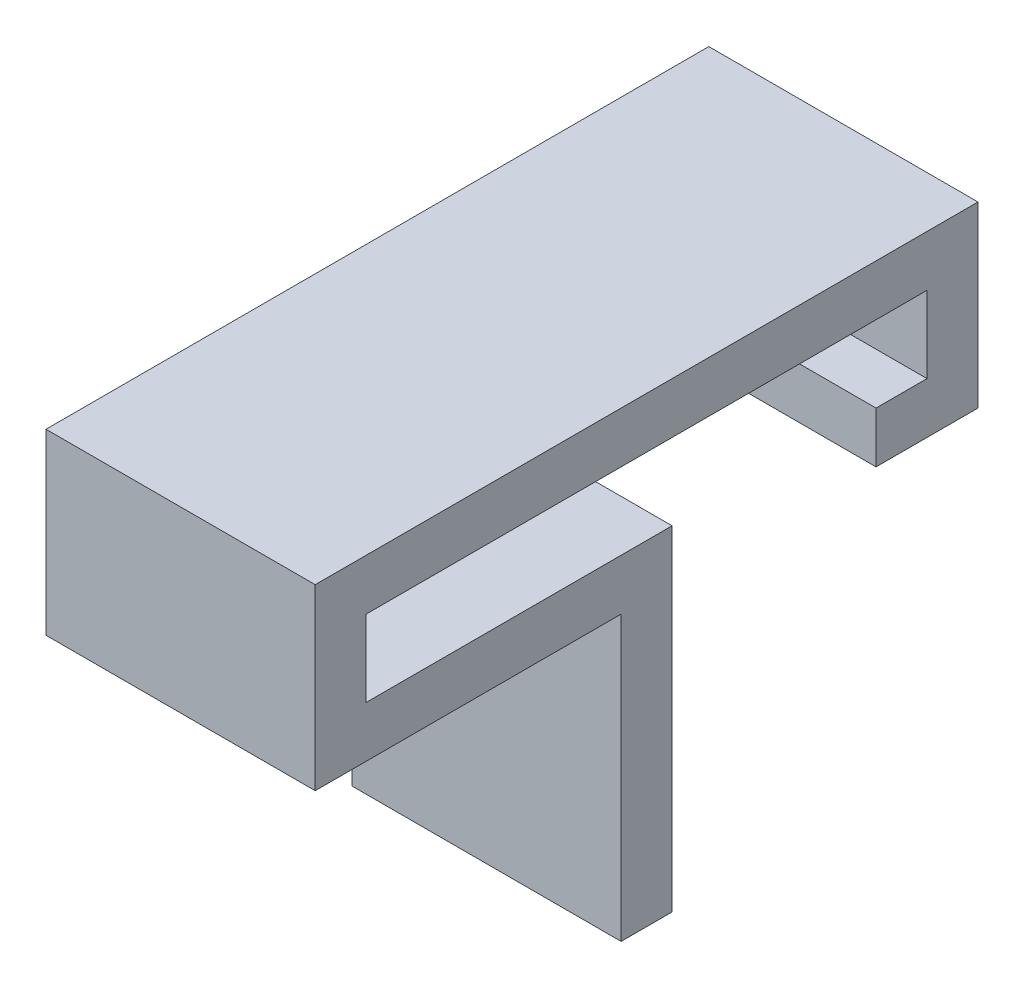
ISO-10303-21;
HEADER;
FILE_DESCRIPTION(('STEP AP214'),'2;1');
FILE_NAME('part.step','',(''),(''),'','','');
FILE_SCHEMA(('AUTOMOTIVE_DESIGN { 1 0 10303 214 1 1 1 1 }'));
ENDSEC;
DATA;
#1=APPLICATION_CONTEXT('core data for automotive mechanical design processes');
#2=APPLICATION_PROTOCOL_DEFINITION('international standard','automotive_design',2000,#1);
#3=PRODUCT_CONTEXT('',#1,'mechanical');
#4=PRODUCT('Part','Part','',(#3));
#5=PRODUCT_RELATED_PRODUCT_CATEGORY('part','',(#4));
#6=PRODUCT_DEFINITION_FORMATION('','',#4);
#7=PRODUCT_DEFINITION_CONTEXT('part definition',#1,'design');
#8=PRODUCT_DEFINITION('design','',#6,#7);
#9=PRODUCT_DEFINITION_SHAPE('','',#8);
#10=(LENGTH_UNIT() NAMED_UNIT(*) SI_UNIT(.MILLI.,.METRE.));
#11=(NAMED_UNIT(*) PLANE_ANGLE_UNIT() SI_UNIT($,.RADIAN.));
#12=(NAMED_UNIT(*) SI_UNIT($,.STERADIAN.) SOLID_ANGLE_UNIT());
#13=UNCERTAINTY_MEASURE_WITH_UNIT(LENGTH_MEASURE(1.E-05),#10,'distance_accuracy_value','');
#14=(GEOMETRIC_REPRESENTATION_CONTEXT(3) GLOBAL_UNCERTAINTY_ASSIGNED_CONTEXT((#13)) GLOBAL_UNIT_ASSIGNED_CONTEXT((#10,
#11,#12)) REPRESENTATION_CONTEXT('',''));
#15=CARTESIAN_POINT('',(0.,0.,0.));
#16=DIRECTION('',(0.,0.,1.));
#17=DIRECTION('',(1.,0.,0.));
#18=AXIS2_PLACEMENT_3D('',#15,#16,#17);
#19=CARTESIAN_POINT('',(10.1071129707113,9.30460251046025,-25.));
#20=DIRECTION('',(0.,0.,-1.));
#21=DIRECTION('',(-1.,0.,0.));
#22=AXIS2_PLACEMENT_3D('',#19,#20,#21);
#23=PLANE('',#22);
#24=DIRECTION('',(-1.,0.,0.));
#25=VECTOR('',#24,1.);
#26=CARTESIAN_POINT('',(10.1071129707113,14.3046025104602,-25.));
#27=LINE('',#26,#25);
#28=CARTESIAN_POINT('',(10.1071129707113,14.3046025104602,-25.));
#29=VERTEX_POINT('',#28);
#30=CARTESIAN_POINT('',(-16.2928870292887,14.3046025104602,-25.));
#31=VERTEX_POINT('',#30);
#32=EDGE_CURVE('E158',#29,#31,#27,.T.);
#33=ORIENTED_EDGE('',*,*,#32,.F.);
#34=DIRECTION('',(0.,1.,0.));
#35=VECTOR('',#34,1.);
#36=CARTESIAN_POINT('',(10.1071129707113,9.30460251046025,-25.));
#37=LINE('',#36,#35);
#38=CARTESIAN_POINT('',(10.1071129707113,21.8046025104602,-25.));
#39=VERTEX_POINT('',#38);
#40=EDGE_CURVE('E164',#29,#39,#37,.T.);
#41=ORIENTED_EDGE('',*,*,#40,.T.);
#42=DIRECTION('',(-1.,0.,0.));
#43=VECTOR('',#42,1.);
#44=CARTESIAN_POINT('',(10.1071129707113,21.8046025104602,-25.));
#45=LINE('',#44,#43);
#46=CARTESIAN_POINT('',(-16.2928870292887,21.8046025104603,-25.));
#47=VERTEX_POINT('',#46);
#48=EDGE_CURVE('E165',#39,#47,#45,.T.);
#49=ORIENTED_EDGE('',*,*,#48,.T.);
#50=DIRECTION('',(0.,1.,0.));
#51=VECTOR('',#50,1.);
#52=CARTESIAN_POINT('',(-16.2928870292887,9.30460251046025,-25.));
#53=LINE('',#52,#51);
#54=EDGE_CURVE('E179',#31,#47,#53,.T.);
#55=ORIENTED_EDGE('',*,*,#54,.F.);
#56=EDGE_LOOP('',(#33,#41,#49,#55));
#57=FACE_BOUND('',#56,.T.);
#58=ADVANCED_FACE('F35',(#57),#23,.F.);
#59=CARTESIAN_POINT('',(-16.2928870292887,21.8046025104603,-30.));
#60=DIRECTION('',(0.,1.,0.));
#61=DIRECTION('',(-1.,0.,0.));
#62=AXIS2_PLACEMENT_3D('',#59,#60,#61);
#63=PLANE('',#62);
#64=ORIENTED_EDGE('',*,*,#48,.F.);
#65=DIRECTION('',(0.,0.,1.));
#66=VECTOR('',#65,1.);
#67=CARTESIAN_POINT('',(10.1071129707113,21.8046025104602,-30.));
#68=LINE('',#67,#66);
#69=CARTESIAN_POINT('',(10.1071129707113,21.8046025104602,30.));
#70=VERTEX_POINT('',#69);
#71=EDGE_CURVE('E196',#39,#70,#68,.T.);
#72=ORIENTED_EDGE('',*,*,#71,.T.);
#73=DIRECTION('',(-1.,0.,0.));
#74=VECTOR('',#73,1.);
#75=CARTESIAN_POINT('',(-16.2928870292887,21.8046025104603,30.));
#76=LINE('',#75,#74);
#77=CARTESIAN_POINT('',(-16.2928870292887,21.8046025104603,30.));
#78=VERTEX_POINT('',#77);
#79=EDGE_CURVE('E183',#70,#78,#76,.T.);
#80=ORIENTED_EDGE('',*,*,#79,.T.);
#81=DIRECTION('',(0.,0.,1.));
#82=VECTOR('',#81,1.);
#83=CARTESIAN_POINT('',(-16.2928870292887,21.8046025104603,-30.));
#84=LINE('',#83,#82);
#85=EDGE_CURVE('E192',#47,#78,#84,.T.);
#86=ORIENTED_EDGE('',*,*,#85,.F.);
#87=EDGE_LOOP('',(#64,#72,#80,#86));
#88=FACE_BOUND('',#87,.T.);
#89=ADVANCED_FACE('F260',(#88),#63,.F.);
#90=CARTESIAN_POINT('',(-16.2928870292887,26.8046025104603,30.));
#91=DIRECTION('',(0.,0.,1.));
#92=DIRECTION('',(1.,0.,0.));
#93=AXIS2_PLACEMENT_3D('',#90,#91,#92);
#94=PLANE('',#93);
#95=ORIENTED_EDGE('',*,*,#79,.F.);
#96=DIRECTION('',(0.,-1.,0.));
#97=VECTOR('',#96,1.);
#98=CARTESIAN_POINT('',(10.1071129707113,26.8046025104603,30.));
#99=LINE('',#98,#97);
#100=CARTESIAN_POINT('',(10.1071129707113,14.3046025104603,30.));
#101=VERTEX_POINT('',#100);
#102=EDGE_CURVE('E50',#70,#101,#99,.T.);
#103=ORIENTED_EDGE('',*,*,#102,.T.);
#104=DIRECTION('',(-1.,0.,0.));
#105=VECTOR('',#104,1.);
#106=CARTESIAN_POINT('',(-16.2928870292887,14.3046025104603,30.));
#107=LINE('',#106,#105);
#108=CARTESIAN_POINT('',(-16.2928870292887,14.3046025104603,30.));
#109=VERTEX_POINT('',#108);
#110=EDGE_CURVE('E198',#101,#109,#107,.T.);
#111=ORIENTED_EDGE('',*,*,#110,.T.);
#112=DIRECTION('',(0.,-1.,0.));
#113=VECTOR('',#112,1.);
#114=CARTESIAN_POINT('',(-16.2928870292887,26.8046025104603,30.));
#115=LINE('',#114,#113);
#116=EDGE_CURVE('E207',#78,#109,#115,.T.);
#117=ORIENTED_EDGE('',*,*,#116,.F.);
#118=EDGE_LOOP('',(#95,#103,#111,#117));
#119=FACE_BOUND('',#118,.T.);
#120=ADVANCED_FACE('F263',(#119),#94,.F.);
#121=CARTESIAN_POINT('',(-16.2928870292887,14.3046025104603,5.));
#122=DIRECTION('',(0.,-1.,0.));
#123=DIRECTION('',(0.,0.,-1.));
#124=AXIS2_PLACEMENT_3D('',#121,#122,#123);
#125=PLANE('',#124);
#126=ORIENTED_EDGE('',*,*,#110,.F.);
#127=DIRECTION('',(0.,0.,-1.));
#128=VECTOR('',#127,1.);
#129=CARTESIAN_POINT('',(10.1071129707113,14.3046025104603,5.));
#130=LINE('',#129,#128);
#131=CARTESIAN_POINT('',(10.1071129707113,14.3046025104603,0.));
#132=VERTEX_POINT('',#131);
#133=EDGE_CURVE('E243',#101,#132,#130,.T.);
#134=ORIENTED_EDGE('',*,*,#133,.T.);
#135=DIRECTION('',(-1.,0.,0.));
#136=VECTOR('',#135,1.);
#137=CARTESIAN_POINT('',(-16.2928870292887,14.3046025104603,0.));
#138=LINE('',#137,#136);
#139=CARTESIAN_POINT('',(-16.2928870292887,14.3046025104603,0.));
#140=VERTEX_POINT('',#139);
#141=EDGE_CURVE('E229',#132,#140,#138,.T.);
#142=ORIENTED_EDGE('',*,*,#141,.T.);
#143=DIRECTION('',(0.,0.,-1.));
#144=VECTOR('',#143,1.);
#145=CARTESIAN_POINT('',(-16.2928870292887,14.3046025104603,5.));
#146=LINE('',#145,#144);
#147=EDGE_CURVE('E233',#109,#140,#146,.T.);
#148=ORIENTED_EDGE('',*,*,#147,.F.);
#149=EDGE_LOOP('',(#126,#134,#142,#148));
#150=FACE_BOUND('',#149,.T.);
#151=ADVANCED_FACE('F257',(#150),#125,.F.);
#152=CARTESIAN_POINT('',(-16.2928870292887,14.3046025104603,5.));
#153=DIRECTION('',(1.,0.,0.));
#154=DIRECTION('',(0.,1.,0.));
#155=AXIS2_PLACEMENT_3D('',#152,#153,#154);
#156=PLANE('',#155);
#157=DIRECTION('',(0.,-1.,0.));
#158=VECTOR('',#157,1.);
#159=CARTESIAN_POINT('',(-16.2928870292887,14.3046025104603,0.));
#160=LINE('',#159,#158);
#161=CARTESIAN_POINT('',(-16.2928870292887,-18.4953974895397,0.));
#162=VERTEX_POINT('',#161);
#163=EDGE_CURVE('E225',#140,#162,#160,.T.);
#164=ORIENTED_EDGE('',*,*,#163,.T.);
#165=DIRECTION('',(0.,0.,-1.));
#166=VECTOR('',#165,1.);
#167=CARTESIAN_POINT('',(-16.2928870292887,-18.4953974895397,5.));
#168=LINE('',#167,#166);
#169=CARTESIAN_POINT('',(-16.2928870292887,-18.4953974895397,5.));
#170=VERTEX_POINT('',#169);
#171=EDGE_CURVE('E11',#170,#162,#168,.T.);
#172=ORIENTED_EDGE('',*,*,#171,.F.);
#173=DIRECTION('',(0.,-1.,0.));
#174=VECTOR('',#173,1.);
#175=CARTESIAN_POINT('',(-16.2928870292887,14.3046025104603,5.));
#176=LINE('',#175,#174);
#177=CARTESIAN_POINT('',(-16.2928870292887,9.30460251046025,5.));
#178=VERTEX_POINT('',#177);
#179=EDGE_CURVE('E226',#178,#170,#176,.T.);
#180=ORIENTED_EDGE('',*,*,#179,.F.);
#181=DIRECTION('',(0.,0.,-1.));
#182=VECTOR('',#181,1.);
#183=CARTESIAN_POINT('',(-16.2928870292887,9.30460251046025,35.));
#184=LINE('',#183,#182);
#185=CARTESIAN_POINT('',(-16.2928870292887,9.30460251046025,35.));
#186=VERTEX_POINT('',#185);
#187=EDGE_CURVE('E222',#186,#178,#184,.T.);
#188=ORIENTED_EDGE('',*,*,#187,.F.);
#189=DIRECTION('',(0.,-1.,0.));
#190=VECTOR('',#189,1.);
#191=CARTESIAN_POINT('',(-16.2928870292887,14.3046025104603,35.));
#192=LINE('',#191,#190);
#193=CARTESIAN_POINT('',(-16.2928870292887,26.8046025104603,35.));
#194=VERTEX_POINT('',#193);
#195=EDGE_CURVE('E211',#194,#186,#192,.T.);
#196=ORIENTED_EDGE('',*,*,#195,.F.);
#197=DIRECTION('',(0.,0.,1.));
#198=VECTOR('',#197,1.);
#199=CARTESIAN_POINT('',(-16.2928870292887,26.8046025104603,35.));
#200=LINE('',#199,#198);
#201=CARTESIAN_POINT('',(-16.2928870292887,26.8046025104603,-30.));
#202=VERTEX_POINT('',#201);
#203=EDGE_CURVE('E199',#202,#194,#200,.T.);
#204=ORIENTED_EDGE('',*,*,#203,.F.);
#205=DIRECTION('',(0.,1.,0.));
#206=VECTOR('',#205,1.);
#207=CARTESIAN_POINT('',(-16.2928870292887,26.8046025104603,-30.));
#208=LINE('',#207,#206);
#209=CARTESIAN_POINT('',(-16.2928870292887,9.30460251046025,-30.));
#210=VERTEX_POINT('',#209);
#211=EDGE_CURVE('E184',#210,#202,#208,.T.);
#212=ORIENTED_EDGE('',*,*,#211,.F.);
#213=DIRECTION('',(0.,0.,-1.));
#214=VECTOR('',#213,1.);
#215=CARTESIAN_POINT('',(-16.2928870292887,9.30460251046025,-30.));
#216=LINE('',#215,#214);
#217=CARTESIAN_POINT('',(-16.2928870292887,9.30460251046025,-20.));
#218=VERTEX_POINT('',#217);
#219=EDGE_CURVE('E174',#218,#210,#216,.T.);
#220=ORIENTED_EDGE('',*,*,#219,.F.);
#221=DIRECTION('',(0.,-1.,0.));
#222=VECTOR('',#221,1.);
#223=CARTESIAN_POINT('',(-16.2928870292887,9.30460251046025,-20.));
#224=LINE('',#223,#222);
#225=CARTESIAN_POINT('',(-16.2928870292887,14.3046025104602,-20.));
#226=VERTEX_POINT('',#225);
#227=EDGE_CURVE('E148',#226,#218,#224,.T.);
#228=ORIENTED_EDGE('',*,*,#227,.F.);
#229=DIRECTION('',(0.,0.,-1.));
#230=VECTOR('',#229,1.);
#231=CARTESIAN_POINT('',(-16.2928870292887,14.3046025104602,-20.));
#232=LINE('',#231,#230);
#233=EDGE_CURVE('E144',#226,#31,#232,.T.);
#234=ORIENTED_EDGE('',*,*,#233,.T.);
#235=ORIENTED_EDGE('',*,*,#54,.T.);
#236=ORIENTED_EDGE('',*,*,#85,.T.);
#237=ORIENTED_EDGE('',*,*,#116,.T.);
#238=ORIENTED_EDGE('',*,*,#147,.T.);
#239=EDGE_LOOP('',(#164,#172,#180,#188,#196,#204,#212,#220,#228,#234,#235,#236,#237,#238));
#240=FACE_BOUND('',#239,.T.);
#241=ADVANCED_FACE('F37',(#240),#156,.F.);
#242=CARTESIAN_POINT('',(-16.2928870292887,-18.4953974895397,5.));
#243=DIRECTION('',(0.,1.,0.));
#244=DIRECTION('',(0.,0.,1.));
#245=AXIS2_PLACEMENT_3D('',#242,#243,#244);
#246=PLANE('',#245);
#247=DIRECTION('',(1.,0.,0.));
#248=VECTOR('',#247,1.);
#249=CARTESIAN_POINT('',(-16.2928870292887,-18.4953974895397,0.));
#250=LINE('',#249,#248);
#251=CARTESIAN_POINT('',(10.1071129707113,-18.4953974895397,0.));
#252=VERTEX_POINT('',#251);
#253=EDGE_CURVE('E236',#162,#252,#250,.T.);
#254=ORIENTED_EDGE('',*,*,#253,.T.);
#255=DIRECTION('',(0.,0.,-1.));
#256=VECTOR('',#255,1.);
#257=CARTESIAN_POINT('',(10.1071129707113,-18.4953974895397,5.));
#258=LINE('',#257,#256);
#259=CARTESIAN_POINT('',(10.1071129707113,-18.4953974895397,5.));
#260=VERTEX_POINT('',#259);
#261=EDGE_CURVE('E43',#260,#252,#258,.T.);
#262=ORIENTED_EDGE('',*,*,#261,.F.);
#263=DIRECTION('',(1.,0.,0.));
#264=VECTOR('',#263,1.);
#265=CARTESIAN_POINT('',(-16.2928870292887,-18.4953974895397,5.));
#266=LINE('',#265,#264);
#267=EDGE_CURVE('E228',#170,#260,#266,.T.);
#268=ORIENTED_EDGE('',*,*,#267,.F.);
#269=ORIENTED_EDGE('',*,*,#171,.T.);
#270=EDGE_LOOP('',(#254,#262,#268,#269));
#271=FACE_BOUND('',#270,.T.);
#272=ADVANCED_FACE('F289',(#271),#246,.F.);
#273=CARTESIAN_POINT('',(10.1071129707113,14.3046025104603,5.));
#274=DIRECTION('',(-1.,0.,0.));
#275=DIRECTION('',(0.,-1.,0.));
#276=AXIS2_PLACEMENT_3D('',#273,#274,#275);
#277=PLANE('',#276);
#278=DIRECTION('',(0.,1.,0.));
#279=VECTOR('',#278,1.);
#280=CARTESIAN_POINT('',(10.1071129707113,14.3046025104603,0.));
#281=LINE('',#280,#279);
#282=EDGE_CURVE('E238',#252,#132,#281,.T.);
#283=ORIENTED_EDGE('',*,*,#282,.T.);
#284=ORIENTED_EDGE('',*,*,#133,.F.);
#285=ORIENTED_EDGE('',*,*,#102,.F.);
#286=ORIENTED_EDGE('',*,*,#71,.F.);
#287=ORIENTED_EDGE('',*,*,#40,.F.);
#288=DIRECTION('',(0.,0.,-1.));
#289=VECTOR('',#288,1.);
#290=CARTESIAN_POINT('',(10.1071129707113,14.3046025104602,-20.));
#291=LINE('',#290,#289);
#292=CARTESIAN_POINT('',(10.1071129707113,14.3046025104602,-20.));
#293=VERTEX_POINT('',#292);
#294=EDGE_CURVE('E141',#293,#29,#291,.T.);
#295=ORIENTED_EDGE('',*,*,#294,.F.);
#296=DIRECTION('',(0.,1.,0.));
#297=VECTOR('',#296,1.);
#298=CARTESIAN_POINT('',(10.1071129707113,9.30460251046025,-20.));
#299=LINE('',#298,#297);
#300=CARTESIAN_POINT('',(10.1071129707113,9.30460251046025,-20.));
#301=VERTEX_POINT('',#300);
#302=EDGE_CURVE('E149',#301,#293,#299,.T.);
#303=ORIENTED_EDGE('',*,*,#302,.F.);
#304=DIRECTION('',(0.,0.,1.));
#305=VECTOR('',#304,1.);
#306=CARTESIAN_POINT('',(10.1071129707113,9.30460251046025,-30.));
#307=LINE('',#306,#305);
#308=CARTESIAN_POINT('',(10.1071129707113,9.30460251046025,-30.));
#309=VERTEX_POINT('',#308);
#310=EDGE_CURVE('E168',#309,#301,#307,.T.);
#311=ORIENTED_EDGE('',*,*,#310,.F.);
#312=DIRECTION('',(0.,-1.,0.));
#313=VECTOR('',#312,1.);
#314=CARTESIAN_POINT('',(10.1071129707113,26.8046025104603,-30.));
#315=LINE('',#314,#313);
#316=CARTESIAN_POINT('',(10.1071129707113,26.8046025104603,-30.));
#317=VERTEX_POINT('',#316);
#318=EDGE_CURVE('E190',#317,#309,#315,.T.);
#319=ORIENTED_EDGE('',*,*,#318,.F.);
#320=DIRECTION('',(0.,0.,-1.));
#321=VECTOR('',#320,1.);
#322=CARTESIAN_POINT('',(10.1071129707113,26.8046025104603,35.));
#323=LINE('',#322,#321);
#324=CARTESIAN_POINT('',(10.1071129707113,26.8046025104603,35.));
#325=VERTEX_POINT('',#324);
#326=EDGE_CURVE('E205',#325,#317,#323,.T.);
#327=ORIENTED_EDGE('',*,*,#326,.F.);
#328=DIRECTION('',(0.,1.,0.));
#329=VECTOR('',#328,1.);
#330=CARTESIAN_POINT('',(10.1071129707113,14.3046025104603,35.));
#331=LINE('',#330,#329);
#332=CARTESIAN_POINT('',(10.1071129707113,9.30460251046025,35.));
#333=VERTEX_POINT('',#332);
#334=EDGE_CURVE('E216',#333,#325,#331,.T.);
#335=ORIENTED_EDGE('',*,*,#334,.F.);
#336=DIRECTION('',(0.,0.,-1.));
#337=VECTOR('',#336,1.);
#338=CARTESIAN_POINT('',(10.1071129707113,9.30460251046025,35.));
#339=LINE('',#338,#337);
#340=CARTESIAN_POINT('',(10.1071129707113,9.30460251046025,5.));
#341=VERTEX_POINT('',#340);
#342=EDGE_CURVE('E218',#333,#341,#339,.T.);
#343=ORIENTED_EDGE('',*,*,#342,.T.);
#344=DIRECTION('',(0.,1.,0.));
#345=VECTOR('',#344,1.);
#346=CARTESIAN_POINT('',(10.1071129707113,14.3046025104603,5.));
#347=LINE('',#346,#345);
#348=EDGE_CURVE('E231',#260,#341,#347,.T.);
#349=ORIENTED_EDGE('',*,*,#348,.F.);
#350=ORIENTED_EDGE('',*,*,#261,.T.);
#351=EDGE_LOOP('',(#283,#284,#285,#286,#287,#295,#303,#311,#319,#327,#335,#343,#349,#350));
#352=FACE_BOUND('',#351,.T.);
#353=ADVANCED_FACE('F162',(#352),#277,.F.);
#354=CARTESIAN_POINT('',(0.,0.,5.));
#355=DIRECTION('',(0.,0.,1.));
#356=DIRECTION('',(1.,0.,0.));
#357=AXIS2_PLACEMENT_3D('',#354,#355,#356);
#358=PLANE('',#357);
#359=DIRECTION('',(1.,0.,0.));
#360=VECTOR('',#359,1.);
#361=CARTESIAN_POINT('',(-16.2928870292887,9.30460251046025,5.));
#362=LINE('',#361,#360);
#363=EDGE_CURVE('E58',#178,#341,#362,.T.);
#364=ORIENTED_EDGE('',*,*,#363,.F.);
#365=ORIENTED_EDGE('',*,*,#179,.T.);
#366=ORIENTED_EDGE('',*,*,#267,.T.);
#367=ORIENTED_EDGE('',*,*,#348,.T.);
#368=EDGE_LOOP('',(#364,#365,#366,#367));
#369=FACE_BOUND('',#368,.T.);
#370=ADVANCED_FACE('F288',(#369),#358,.T.);
#371=CARTESIAN_POINT('',(0.,0.,0.));
#372=DIRECTION('',(0.,0.,1.));
#373=DIRECTION('',(1.,0.,0.));
#374=AXIS2_PLACEMENT_3D('',#371,#372,#373);
#375=PLANE('',#374);
#376=ORIENTED_EDGE('',*,*,#163,.F.);
#377=ORIENTED_EDGE('',*,*,#141,.F.);
#378=ORIENTED_EDGE('',*,*,#282,.F.);
#379=ORIENTED_EDGE('',*,*,#253,.F.);
#380=EDGE_LOOP('',(#376,#377,#378,#379));
#381=FACE_BOUND('',#380,.T.);
#382=ADVANCED_FACE('F254',(#381),#375,.F.);
#383=CARTESIAN_POINT('',(-16.2928870292887,9.30460251046025,35.));
#384=DIRECTION('',(0.,1.,0.));
#385=DIRECTION('',(0.,0.,1.));
#386=AXIS2_PLACEMENT_3D('',#383,#384,#385);
#387=PLANE('',#386);
#388=ORIENTED_EDGE('',*,*,#363,.T.);
#389=ORIENTED_EDGE('',*,*,#342,.F.);
#390=DIRECTION('',(1.,0.,0.));
#391=VECTOR('',#390,1.);
#392=CARTESIAN_POINT('',(-16.2928870292887,9.30460251046025,35.));
#393=LINE('',#392,#391);
#394=EDGE_CURVE('E214',#186,#333,#393,.T.);
#395=ORIENTED_EDGE('',*,*,#394,.F.);
#396=ORIENTED_EDGE('',*,*,#187,.T.);
#397=EDGE_LOOP('',(#388,#389,#395,#396));
#398=FACE_BOUND('',#397,.T.);
#399=ADVANCED_FACE('F286',(#398),#387,.F.);
#400=CARTESIAN_POINT('',(0.,0.,35.));
#401=DIRECTION('',(0.,0.,1.));
#402=DIRECTION('',(1.,0.,0.));
#403=AXIS2_PLACEMENT_3D('',#400,#401,#402);
#404=PLANE('',#403);
#405=ORIENTED_EDGE('',*,*,#195,.T.);
#406=ORIENTED_EDGE('',*,*,#394,.T.);
#407=ORIENTED_EDGE('',*,*,#334,.T.);
#408=DIRECTION('',(1.,0.,0.));
#409=VECTOR('',#408,1.);
#410=CARTESIAN_POINT('',(-16.2928870292887,26.8046025104603,35.));
#411=LINE('',#410,#409);
#412=EDGE_CURVE('E202',#194,#325,#411,.T.);
#413=ORIENTED_EDGE('',*,*,#412,.F.);
#414=EDGE_LOOP('',(#405,#406,#407,#413));
#415=FACE_BOUND('',#414,.T.);
#416=ADVANCED_FACE('F282',(#415),#404,.T.);
#417=CARTESIAN_POINT('',(0.,26.8046025104603,0.));
#418=DIRECTION('',(0.,-1.,0.));
#419=DIRECTION('',(0.,0.,-1.));
#420=AXIS2_PLACEMENT_3D('',#417,#418,#419);
#421=PLANE('',#420);
#422=ORIENTED_EDGE('',*,*,#203,.T.);
#423=ORIENTED_EDGE('',*,*,#412,.T.);
#424=ORIENTED_EDGE('',*,*,#326,.T.);
#425=DIRECTION('',(1.,0.,0.));
#426=VECTOR('',#425,1.);
#427=CARTESIAN_POINT('',(-16.2928870292887,26.8046025104603,-30.));
#428=LINE('',#427,#426);
#429=EDGE_CURVE('E187',#202,#317,#428,.T.);
#430=ORIENTED_EDGE('',*,*,#429,.F.);
#431=EDGE_LOOP('',(#422,#423,#424,#430));
#432=FACE_BOUND('',#431,.T.);
#433=ADVANCED_FACE('F279',(#432),#421,.F.);
#434=CARTESIAN_POINT('',(0.,0.,-30.));
#435=DIRECTION('',(0.,0.,1.));
#436=DIRECTION('',(1.,0.,0.));
#437=AXIS2_PLACEMENT_3D('',#434,#435,#436);
#438=PLANE('',#437);
#439=ORIENTED_EDGE('',*,*,#211,.T.);
#440=ORIENTED_EDGE('',*,*,#429,.T.);
#441=ORIENTED_EDGE('',*,*,#318,.T.);
#442=DIRECTION('',(1.,0.,0.));
#443=VECTOR('',#442,1.);
#444=CARTESIAN_POINT('',(10.1071129707113,9.30460251046025,-30.));
#445=LINE('',#444,#443);
#446=EDGE_CURVE('E177',#210,#309,#445,.T.);
#447=ORIENTED_EDGE('',*,*,#446,.F.);
#448=EDGE_LOOP('',(#439,#440,#441,#447));
#449=FACE_BOUND('',#448,.T.);
#450=ADVANCED_FACE('F276',(#449),#438,.F.);
#451=CARTESIAN_POINT('',(0.,9.30460251046025,0.));
#452=DIRECTION('',(0.,-1.,0.));
#453=DIRECTION('',(1.,0.,0.));
#454=AXIS2_PLACEMENT_3D('',#451,#452,#453);
#455=PLANE('',#454);
#456=ORIENTED_EDGE('',*,*,#310,.T.);
#457=DIRECTION('',(1.,0.,0.));
#458=VECTOR('',#457,1.);
#459=CARTESIAN_POINT('',(10.1071129707113,9.30460251046025,-20.));
#460=LINE('',#459,#458);
#461=EDGE_CURVE('E155',#218,#301,#460,.T.);
#462=ORIENTED_EDGE('',*,*,#461,.F.);
#463=ORIENTED_EDGE('',*,*,#219,.T.);
#464=ORIENTED_EDGE('',*,*,#446,.T.);
#465=EDGE_LOOP('',(#456,#462,#463,#464));
#466=FACE_BOUND('',#465,.T.);
#467=ADVANCED_FACE('F270',(#466),#455,.T.);
#468=CARTESIAN_POINT('',(10.1071129707113,14.3046025104602,-20.));
#469=DIRECTION('',(0.,-1.,0.));
#470=DIRECTION('',(1.,0.,0.));
#471=AXIS2_PLACEMENT_3D('',#468,#469,#470);
#472=PLANE('',#471);
#473=ORIENTED_EDGE('',*,*,#32,.T.);
#474=ORIENTED_EDGE('',*,*,#233,.F.);
#475=DIRECTION('',(-1.,0.,0.));
#476=VECTOR('',#475,1.);
#477=CARTESIAN_POINT('',(10.1071129707113,14.3046025104602,-20.));
#478=LINE('',#477,#476);
#479=EDGE_CURVE('E137',#293,#226,#478,.T.);
#480=ORIENTED_EDGE('',*,*,#479,.F.);
#481=ORIENTED_EDGE('',*,*,#294,.T.);
#482=EDGE_LOOP('',(#473,#474,#480,#481));
#483=FACE_BOUND('',#482,.T.);
#484=ADVANCED_FACE('F139',(#483),#472,.F.);
#485=CARTESIAN_POINT('',(0.,0.,-20.));
#486=DIRECTION('',(0.,0.,1.));
#487=DIRECTION('',(1.,0.,0.));
#488=AXIS2_PLACEMENT_3D('',#485,#486,#487);
#489=PLANE('',#488);
#490=ORIENTED_EDGE('',*,*,#302,.T.);
#491=ORIENTED_EDGE('',*,*,#479,.T.);
#492=ORIENTED_EDGE('',*,*,#227,.T.);
#493=ORIENTED_EDGE('',*,*,#461,.T.);
#494=EDGE_LOOP('',(#490,#491,#492,#493));
#495=FACE_BOUND('',#494,.T.);
#496=ADVANCED_FACE('F153',(#495),#489,.T.);
#497=CLOSED_SHELL('',(#58,#89,#120,#151,#241,#272,#353,#370,#382,#399,#416,#433,#450,#467,#484,#496));
#498=MANIFOLD_SOLID_BREP('B2',#497);
#499=ADVANCED_BREP_SHAPE_REPRESENTATION('',(#18,#498),#14);
#500=SHAPE_DEFINITION_REPRESENTATION(#9,#499);
ENDSEC;
END-ISO-10303-21;
